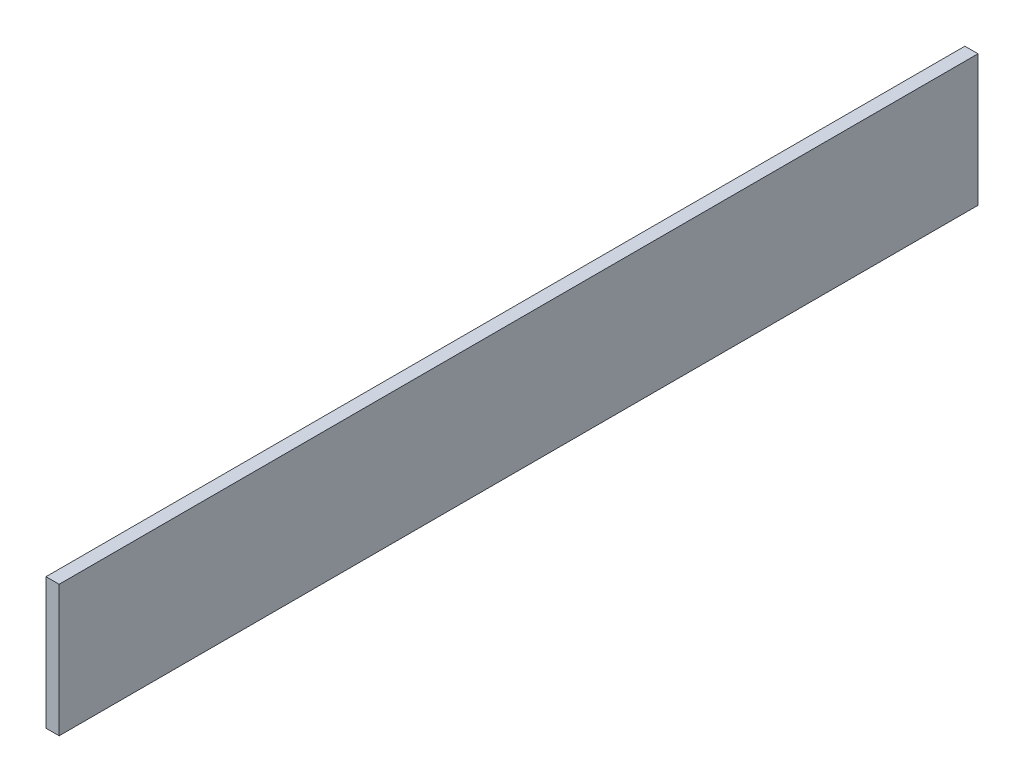
ISO-10303-21;
HEADER;
FILE_DESCRIPTION(('STEP AP214'),'2;1');
FILE_NAME('part.step','',(''),(''),'','','');
FILE_SCHEMA(('AUTOMOTIVE_DESIGN { 1 0 10303 214 1 1 1 1 }'));
ENDSEC;
DATA;
#1=APPLICATION_CONTEXT('core data for automotive mechanical design processes');
#2=APPLICATION_PROTOCOL_DEFINITION('international standard','automotive_design',2000,#1);
#3=PRODUCT_CONTEXT('',#1,'mechanical');
#4=PRODUCT('Part','Part','',(#3));
#5=PRODUCT_RELATED_PRODUCT_CATEGORY('part','',(#4));
#6=PRODUCT_DEFINITION_FORMATION('','',#4);
#7=PRODUCT_DEFINITION_CONTEXT('part definition',#1,'design');
#8=PRODUCT_DEFINITION('design','',#6,#7);
#9=PRODUCT_DEFINITION_SHAPE('','',#8);
#10=(LENGTH_UNIT() NAMED_UNIT(*) SI_UNIT(.MILLI.,.METRE.));
#11=(NAMED_UNIT(*) PLANE_ANGLE_UNIT() SI_UNIT($,.RADIAN.));
#12=(NAMED_UNIT(*) SI_UNIT($,.STERADIAN.) SOLID_ANGLE_UNIT());
#13=UNCERTAINTY_MEASURE_WITH_UNIT(LENGTH_MEASURE(1.E-05),#10,'distance_accuracy_value','');
#14=(GEOMETRIC_REPRESENTATION_CONTEXT(3) GLOBAL_UNCERTAINTY_ASSIGNED_CONTEXT((#13)) GLOBAL_UNIT_ASSIGNED_CONTEXT((#10,
#11,#12)) REPRESENTATION_CONTEXT('',''));
#15=CARTESIAN_POINT('',(0.,0.,0.));
#16=DIRECTION('',(0.,0.,1.));
#17=DIRECTION('',(1.,0.,0.));
#18=AXIS2_PLACEMENT_3D('',#15,#16,#17);
#19=CARTESIAN_POINT('',(0.,10.,0.));
#20=DIRECTION('',(1.,0.,0.));
#21=DIRECTION('',(0.,0.,-1.));
#22=AXIS2_PLACEMENT_3D('',#19,#20,#21);
#23=PLANE('',#22);
#24=DIRECTION('',(0.,0.,1.));
#25=VECTOR('',#24,1.);
#26=CARTESIAN_POINT('',(0.,0.,0.));
#27=LINE('',#26,#25);
#28=CARTESIAN_POINT('',(0.,0.,-70.));
#29=VERTEX_POINT('',#28);
#30=CARTESIAN_POINT('',(0.,0.,0.));
#31=VERTEX_POINT('',#30);
#32=EDGE_CURVE('E106',#29,#31,#27,.T.);
#33=ORIENTED_EDGE('',*,*,#32,.T.);
#34=DIRECTION('',(0.,-1.,0.));
#35=VECTOR('',#34,1.);
#36=CARTESIAN_POINT('',(0.,10.,0.));
#37=LINE('',#36,#35);
#38=CARTESIAN_POINT('',(0.,10.,0.));
#39=VERTEX_POINT('',#38);
#40=EDGE_CURVE('E11',#39,#31,#37,.T.);
#41=ORIENTED_EDGE('',*,*,#40,.F.);
#42=DIRECTION('',(0.,0.,1.));
#43=VECTOR('',#42,1.);
#44=CARTESIAN_POINT('',(0.,10.,0.));
#45=LINE('',#44,#43);
#46=CARTESIAN_POINT('',(0.,10.,-70.));
#47=VERTEX_POINT('',#46);
#48=EDGE_CURVE('E89',#47,#39,#45,.T.);
#49=ORIENTED_EDGE('',*,*,#48,.F.);
#50=DIRECTION('',(0.,-1.,0.));
#51=VECTOR('',#50,1.);
#52=CARTESIAN_POINT('',(0.,10.,-70.));
#53=LINE('',#52,#51);
#54=EDGE_CURVE('E102',#47,#29,#53,.T.);
#55=ORIENTED_EDGE('',*,*,#54,.T.);
#56=EDGE_LOOP('',(#33,#41,#49,#55));
#57=FACE_BOUND('',#56,.T.);
#58=ADVANCED_FACE('F37',(#57),#23,.F.);
#59=CARTESIAN_POINT('',(0.,10.,0.));
#60=DIRECTION('',(0.,0.,-1.));
#61=DIRECTION('',(-1.,0.,0.));
#62=AXIS2_PLACEMENT_3D('',#59,#60,#61);
#63=PLANE('',#62);
#64=DIRECTION('',(1.,0.,0.));
#65=VECTOR('',#64,1.);
#66=CARTESIAN_POINT('',(0.,0.,0.));
#67=LINE('',#66,#65);
#68=CARTESIAN_POINT('',(1.,0.,0.));
#69=VERTEX_POINT('',#68);
#70=EDGE_CURVE('E94',#31,#69,#67,.T.);
#71=ORIENTED_EDGE('',*,*,#70,.T.);
#72=DIRECTION('',(0.,-1.,0.));
#73=VECTOR('',#72,1.);
#74=CARTESIAN_POINT('',(1.,10.,0.));
#75=LINE('',#74,#73);
#76=CARTESIAN_POINT('',(1.,10.,0.));
#77=VERTEX_POINT('',#76);
#78=EDGE_CURVE('E46',#77,#69,#75,.T.);
#79=ORIENTED_EDGE('',*,*,#78,.F.);
#80=DIRECTION('',(1.,0.,0.));
#81=VECTOR('',#80,1.);
#82=CARTESIAN_POINT('',(0.,10.,0.));
#83=LINE('',#82,#81);
#84=EDGE_CURVE('E84',#39,#77,#83,.T.);
#85=ORIENTED_EDGE('',*,*,#84,.F.);
#86=ORIENTED_EDGE('',*,*,#40,.T.);
#87=EDGE_LOOP('',(#71,#79,#85,#86));
#88=FACE_BOUND('',#87,.T.);
#89=ADVANCED_FACE('F93',(#88),#63,.F.);
#90=CARTESIAN_POINT('',(1.,10.,0.));
#91=DIRECTION('',(-1.,0.,0.));
#92=DIRECTION('',(0.,0.,1.));
#93=AXIS2_PLACEMENT_3D('',#90,#91,#92);
#94=PLANE('',#93);
#95=DIRECTION('',(0.,0.,-1.));
#96=VECTOR('',#95,1.);
#97=CARTESIAN_POINT('',(1.,0.,0.));
#98=LINE('',#97,#96);
#99=CARTESIAN_POINT('',(1.,0.,-70.));
#100=VERTEX_POINT('',#99);
#101=EDGE_CURVE('E71',#69,#100,#98,.T.);
#102=ORIENTED_EDGE('',*,*,#101,.T.);
#103=DIRECTION('',(0.,-1.,0.));
#104=VECTOR('',#103,1.);
#105=CARTESIAN_POINT('',(1.,10.,-70.));
#106=LINE('',#105,#104);
#107=CARTESIAN_POINT('',(1.,10.,-70.));
#108=VERTEX_POINT('',#107);
#109=EDGE_CURVE('E96',#108,#100,#106,.T.);
#110=ORIENTED_EDGE('',*,*,#109,.F.);
#111=DIRECTION('',(0.,0.,-1.));
#112=VECTOR('',#111,1.);
#113=CARTESIAN_POINT('',(1.,10.,0.));
#114=LINE('',#113,#112);
#115=EDGE_CURVE('E87',#77,#108,#114,.T.);
#116=ORIENTED_EDGE('',*,*,#115,.F.);
#117=ORIENTED_EDGE('',*,*,#78,.T.);
#118=EDGE_LOOP('',(#102,#110,#116,#117));
#119=FACE_BOUND('',#118,.T.);
#120=ADVANCED_FACE('F97',(#119),#94,.F.);
#121=CARTESIAN_POINT('',(0.,10.,-70.));
#122=DIRECTION('',(0.,0.,1.));
#123=DIRECTION('',(1.,0.,0.));
#124=AXIS2_PLACEMENT_3D('',#121,#122,#123);
#125=PLANE('',#124);
#126=DIRECTION('',(-1.,0.,0.));
#127=VECTOR('',#126,1.);
#128=CARTESIAN_POINT('',(0.,0.,-70.));
#129=LINE('',#128,#127);
#130=EDGE_CURVE('E77',#100,#29,#129,.T.);
#131=ORIENTED_EDGE('',*,*,#130,.T.);
#132=ORIENTED_EDGE('',*,*,#54,.F.);
#133=DIRECTION('',(-1.,0.,0.));
#134=VECTOR('',#133,1.);
#135=CARTESIAN_POINT('',(0.,10.,-70.));
#136=LINE('',#135,#134);
#137=EDGE_CURVE('E54',#108,#47,#136,.T.);
#138=ORIENTED_EDGE('',*,*,#137,.F.);
#139=ORIENTED_EDGE('',*,*,#109,.T.);
#140=EDGE_LOOP('',(#131,#132,#138,#139));
#141=FACE_BOUND('',#140,.T.);
#142=ADVANCED_FACE('F120',(#141),#125,.F.);
#143=CARTESIAN_POINT('',(0.,10.,0.));
#144=DIRECTION('',(0.,-1.,0.));
#145=DIRECTION('',(0.,0.,-1.));
#146=AXIS2_PLACEMENT_3D('',#143,#144,#145);
#147=PLANE('',#146);
#148=ORIENTED_EDGE('',*,*,#48,.T.);
#149=ORIENTED_EDGE('',*,*,#84,.T.);
#150=ORIENTED_EDGE('',*,*,#115,.T.);
#151=ORIENTED_EDGE('',*,*,#137,.T.);
#152=EDGE_LOOP('',(#148,#149,#150,#151));
#153=FACE_BOUND('',#152,.T.);
#154=ADVANCED_FACE('F85',(#153),#147,.F.);
#155=CARTESIAN_POINT('',(0.,0.,0.));
#156=DIRECTION('',(0.,-1.,0.));
#157=DIRECTION('',(0.,0.,-1.));
#158=AXIS2_PLACEMENT_3D('',#155,#156,#157);
#159=PLANE('',#158);
#160=ORIENTED_EDGE('',*,*,#32,.F.);
#161=ORIENTED_EDGE('',*,*,#130,.F.);
#162=ORIENTED_EDGE('',*,*,#101,.F.);
#163=ORIENTED_EDGE('',*,*,#70,.F.);
#164=EDGE_LOOP('',(#160,#161,#162,#163));
#165=FACE_BOUND('',#164,.T.);
#166=ADVANCED_FACE('F123',(#165),#159,.T.);
#167=CLOSED_SHELL('',(#58,#89,#120,#142,#154,#166));
#168=MANIFOLD_SOLID_BREP('B2',#167);
#169=ADVANCED_BREP_SHAPE_REPRESENTATION('',(#18,#168),#14);
#170=SHAPE_DEFINITION_REPRESENTATION(#9,#169);
ENDSEC;
END-ISO-10303-21;
